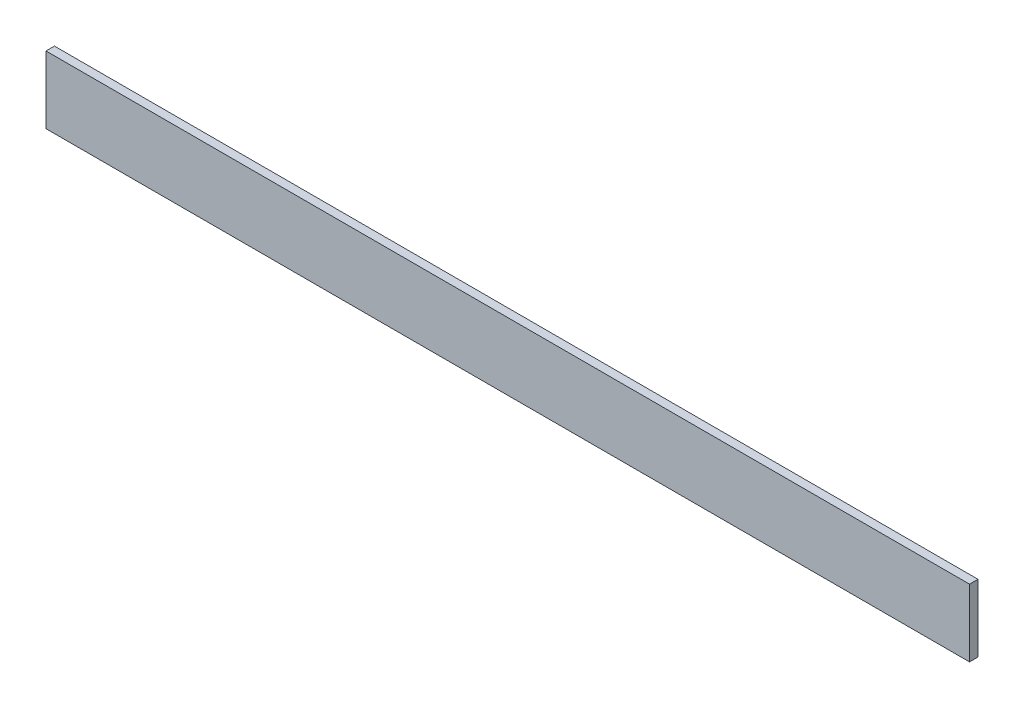
ISO-10303-21;
HEADER;
FILE_DESCRIPTION(('STEP AP214'),'2;1');
FILE_NAME('part.step','',(''),(''),'','','');
FILE_SCHEMA(('AUTOMOTIVE_DESIGN { 1 0 10303 214 1 1 1 1 }'));
ENDSEC;
DATA;
#1=APPLICATION_CONTEXT('core data for automotive mechanical design processes');
#2=APPLICATION_PROTOCOL_DEFINITION('international standard','automotive_design',2000,#1);
#3=PRODUCT_CONTEXT('',#1,'mechanical');
#4=PRODUCT('Part','Part','',(#3));
#5=PRODUCT_RELATED_PRODUCT_CATEGORY('part','',(#4));
#6=PRODUCT_DEFINITION_FORMATION('','',#4);
#7=PRODUCT_DEFINITION_CONTEXT('part definition',#1,'design');
#8=PRODUCT_DEFINITION('design','',#6,#7);
#9=PRODUCT_DEFINITION_SHAPE('','',#8);
#10=(LENGTH_UNIT() NAMED_UNIT(*) SI_UNIT(.MILLI.,.METRE.));
#11=(NAMED_UNIT(*) PLANE_ANGLE_UNIT() SI_UNIT($,.RADIAN.));
#12=(NAMED_UNIT(*) SI_UNIT($,.STERADIAN.) SOLID_ANGLE_UNIT());
#13=UNCERTAINTY_MEASURE_WITH_UNIT(LENGTH_MEASURE(1.E-05),#10,'distance_accuracy_value','');
#14=(GEOMETRIC_REPRESENTATION_CONTEXT(3) GLOBAL_UNCERTAINTY_ASSIGNED_CONTEXT((#13)) GLOBAL_UNIT_ASSIGNED_CONTEXT((#10,
#11,#12)) REPRESENTATION_CONTEXT('',''));
#15=CARTESIAN_POINT('',(0.,0.,0.));
#16=DIRECTION('',(0.,0.,1.));
#17=DIRECTION('',(1.,0.,0.));
#18=AXIS2_PLACEMENT_3D('',#15,#16,#17);
#19=CARTESIAN_POINT('',(-82.55,25.4,5.588));
#20=DIRECTION('',(1.,0.,0.));
#21=DIRECTION('',(0.,0.,-1.));
#22=AXIS2_PLACEMENT_3D('',#19,#20,#21);
#23=PLANE('',#22);
#24=DIRECTION('',(0.,-1.,0.));
#25=VECTOR('',#24,1.);
#26=CARTESIAN_POINT('',(-82.55,25.4,0.));
#27=LINE('',#26,#25);
#28=CARTESIAN_POINT('',(-82.55,25.4,0.));
#29=VERTEX_POINT('',#28);
#30=CARTESIAN_POINT('',(-82.55,-19.05,0.));
#31=VERTEX_POINT('',#30);
#32=EDGE_CURVE('E98',#29,#31,#27,.T.);
#33=ORIENTED_EDGE('',*,*,#32,.T.);
#34=DIRECTION('',(0.,0.,-1.));
#35=VECTOR('',#34,1.);
#36=CARTESIAN_POINT('',(-82.55,-19.05,5.588));
#37=LINE('',#36,#35);
#38=CARTESIAN_POINT('',(-82.55,-19.05,5.588));
#39=VERTEX_POINT('',#38);
#40=EDGE_CURVE('E11',#39,#31,#37,.T.);
#41=ORIENTED_EDGE('',*,*,#40,.F.);
#42=DIRECTION('',(0.,-1.,0.));
#43=VECTOR('',#42,1.);
#44=CARTESIAN_POINT('',(-82.55,25.4,5.588));
#45=LINE('',#44,#43);
#46=CARTESIAN_POINT('',(-82.55,25.4,5.588));
#47=VERTEX_POINT('',#46);
#48=EDGE_CURVE('E86',#47,#39,#45,.T.);
#49=ORIENTED_EDGE('',*,*,#48,.F.);
#50=DIRECTION('',(0.,0.,-1.));
#51=VECTOR('',#50,1.);
#52=CARTESIAN_POINT('',(-82.55,25.4,5.588));
#53=LINE('',#52,#51);
#54=EDGE_CURVE('E94',#47,#29,#53,.T.);
#55=ORIENTED_EDGE('',*,*,#54,.T.);
#56=EDGE_LOOP('',(#33,#41,#49,#55));
#57=FACE_BOUND('',#56,.T.);
#58=ADVANCED_FACE('F35',(#57),#23,.F.);
#59=CARTESIAN_POINT('',(-82.55,-19.05,5.588));
#60=DIRECTION('',(0.,1.,0.));
#61=DIRECTION('',(0.,0.,1.));
#62=AXIS2_PLACEMENT_3D('',#59,#60,#61);
#63=PLANE('',#62);
#64=DIRECTION('',(1.,0.,0.));
#65=VECTOR('',#64,1.);
#66=CARTESIAN_POINT('',(-82.55,-19.05,0.));
#67=LINE('',#66,#65);
#68=CARTESIAN_POINT('',(527.05,-19.05,0.));
#69=VERTEX_POINT('',#68);
#70=EDGE_CURVE('E90',#31,#69,#67,.T.);
#71=ORIENTED_EDGE('',*,*,#70,.T.);
#72=DIRECTION('',(0.,0.,-1.));
#73=VECTOR('',#72,1.);
#74=CARTESIAN_POINT('',(527.05,-19.05,5.588));
#75=LINE('',#74,#73);
#76=CARTESIAN_POINT('',(527.05,-19.05,5.588));
#77=VERTEX_POINT('',#76);
#78=EDGE_CURVE('E43',#77,#69,#75,.T.);
#79=ORIENTED_EDGE('',*,*,#78,.F.);
#80=DIRECTION('',(1.,0.,0.));
#81=VECTOR('',#80,1.);
#82=CARTESIAN_POINT('',(-82.55,-19.05,5.588));
#83=LINE('',#82,#81);
#84=EDGE_CURVE('E81',#39,#77,#83,.T.);
#85=ORIENTED_EDGE('',*,*,#84,.F.);
#86=ORIENTED_EDGE('',*,*,#40,.T.);
#87=EDGE_LOOP('',(#71,#79,#85,#86));
#88=FACE_BOUND('',#87,.T.);
#89=ADVANCED_FACE('F89',(#88),#63,.F.);
#90=CARTESIAN_POINT('',(527.05,25.4,5.588));
#91=DIRECTION('',(-1.,0.,0.));
#92=DIRECTION('',(0.,0.,1.));
#93=AXIS2_PLACEMENT_3D('',#90,#91,#92);
#94=PLANE('',#93);
#95=DIRECTION('',(0.,1.,0.));
#96=VECTOR('',#95,1.);
#97=CARTESIAN_POINT('',(527.05,25.4,0.));
#98=LINE('',#97,#96);
#99=CARTESIAN_POINT('',(527.05,25.4,0.));
#100=VERTEX_POINT('',#99);
#101=EDGE_CURVE('E68',#69,#100,#98,.T.);
#102=ORIENTED_EDGE('',*,*,#101,.T.);
#103=DIRECTION('',(0.,0.,-1.));
#104=VECTOR('',#103,1.);
#105=CARTESIAN_POINT('',(527.05,25.4,5.588));
#106=LINE('',#105,#104);
#107=CARTESIAN_POINT('',(527.05,25.4,5.588));
#108=VERTEX_POINT('',#107);
#109=EDGE_CURVE('E91',#108,#100,#106,.T.);
#110=ORIENTED_EDGE('',*,*,#109,.F.);
#111=DIRECTION('',(0.,1.,0.));
#112=VECTOR('',#111,1.);
#113=CARTESIAN_POINT('',(527.05,25.4,5.588));
#114=LINE('',#113,#112);
#115=EDGE_CURVE('E84',#77,#108,#114,.T.);
#116=ORIENTED_EDGE('',*,*,#115,.F.);
#117=ORIENTED_EDGE('',*,*,#78,.T.);
#118=EDGE_LOOP('',(#102,#110,#116,#117));
#119=FACE_BOUND('',#118,.T.);
#120=ADVANCED_FACE('F92',(#119),#94,.F.);
#121=CARTESIAN_POINT('',(-82.55,25.4,5.588));
#122=DIRECTION('',(0.,-1.,0.));
#123=DIRECTION('',(0.,0.,-1.));
#124=AXIS2_PLACEMENT_3D('',#121,#122,#123);
#125=PLANE('',#124);
#126=DIRECTION('',(-1.,0.,0.));
#127=VECTOR('',#126,1.);
#128=CARTESIAN_POINT('',(-82.55,25.4,0.));
#129=LINE('',#128,#127);
#130=EDGE_CURVE('E74',#100,#29,#129,.T.);
#131=ORIENTED_EDGE('',*,*,#130,.T.);
#132=ORIENTED_EDGE('',*,*,#54,.F.);
#133=DIRECTION('',(-1.,0.,0.));
#134=VECTOR('',#133,1.);
#135=CARTESIAN_POINT('',(-82.55,25.4,5.588));
#136=LINE('',#135,#134);
#137=EDGE_CURVE('E51',#108,#47,#136,.T.);
#138=ORIENTED_EDGE('',*,*,#137,.F.);
#139=ORIENTED_EDGE('',*,*,#109,.T.);
#140=EDGE_LOOP('',(#131,#132,#138,#139));
#141=FACE_BOUND('',#140,.T.);
#142=ADVANCED_FACE('F105',(#141),#125,.F.);
#143=CARTESIAN_POINT('',(0.,0.,5.588));
#144=DIRECTION('',(0.,0.,1.));
#145=DIRECTION('',(1.,0.,0.));
#146=AXIS2_PLACEMENT_3D('',#143,#144,#145);
#147=PLANE('',#146);
#148=ORIENTED_EDGE('',*,*,#48,.T.);
#149=ORIENTED_EDGE('',*,*,#84,.T.);
#150=ORIENTED_EDGE('',*,*,#115,.T.);
#151=ORIENTED_EDGE('',*,*,#137,.T.);
#152=EDGE_LOOP('',(#148,#149,#150,#151));
#153=FACE_BOUND('',#152,.T.);
#154=ADVANCED_FACE('F82',(#153),#147,.T.);
#155=CARTESIAN_POINT('',(0.,0.,0.));
#156=DIRECTION('',(0.,0.,1.));
#157=DIRECTION('',(1.,0.,0.));
#158=AXIS2_PLACEMENT_3D('',#155,#156,#157);
#159=PLANE('',#158);
#160=ORIENTED_EDGE('',*,*,#32,.F.);
#161=ORIENTED_EDGE('',*,*,#130,.F.);
#162=ORIENTED_EDGE('',*,*,#101,.F.);
#163=ORIENTED_EDGE('',*,*,#70,.F.);
#164=EDGE_LOOP('',(#160,#161,#162,#163));
#165=FACE_BOUND('',#164,.T.);
#166=ADVANCED_FACE('F108',(#165),#159,.F.);
#167=CLOSED_SHELL('',(#58,#89,#120,#142,#154,#166));
#168=MANIFOLD_SOLID_BREP('B2',#167);
#169=ADVANCED_BREP_SHAPE_REPRESENTATION('',(#18,#168),#14);
#170=SHAPE_DEFINITION_REPRESENTATION(#9,#169);
ENDSEC;
END-ISO-10303-21;
